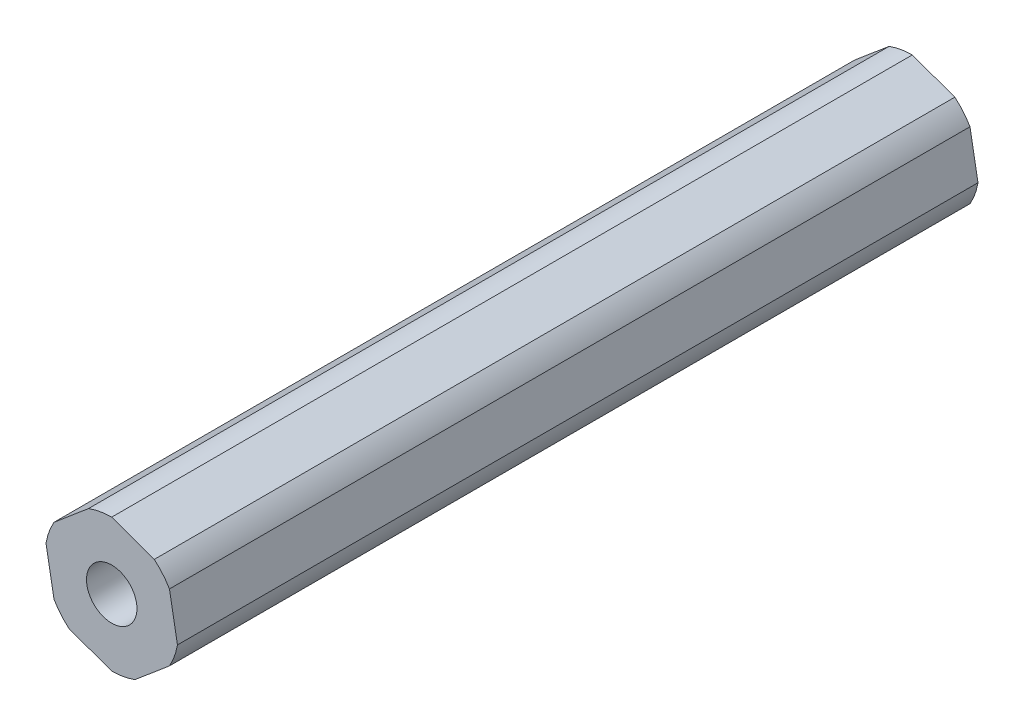
ISO-10303-21;
HEADER;
FILE_DESCRIPTION(('STEP AP214'),'2;1');
FILE_NAME('part.step','',(''),(''),'','','');
FILE_SCHEMA(('AUTOMOTIVE_DESIGN { 1 0 10303 214 1 1 1 1 }'));
ENDSEC;
DATA;
#1=APPLICATION_CONTEXT('core data for automotive mechanical design processes');
#2=APPLICATION_PROTOCOL_DEFINITION('international standard','automotive_design',2000,#1);
#3=PRODUCT_CONTEXT('',#1,'mechanical');
#4=PRODUCT('Part','Part','',(#3));
#5=PRODUCT_RELATED_PRODUCT_CATEGORY('part','',(#4));
#6=PRODUCT_DEFINITION_FORMATION('','',#4);
#7=PRODUCT_DEFINITION_CONTEXT('part definition',#1,'design');
#8=PRODUCT_DEFINITION('design','',#6,#7);
#9=PRODUCT_DEFINITION_SHAPE('','',#8);
#10=(LENGTH_UNIT() NAMED_UNIT(*) SI_UNIT(.MILLI.,.METRE.));
#11=(NAMED_UNIT(*) PLANE_ANGLE_UNIT() SI_UNIT($,.RADIAN.));
#12=(NAMED_UNIT(*) SI_UNIT($,.STERADIAN.) SOLID_ANGLE_UNIT());
#13=UNCERTAINTY_MEASURE_WITH_UNIT(LENGTH_MEASURE(1.E-05),#10,'distance_accuracy_value','');
#14=(GEOMETRIC_REPRESENTATION_CONTEXT(3) GLOBAL_UNCERTAINTY_ASSIGNED_CONTEXT((#13)) GLOBAL_UNIT_ASSIGNED_CONTEXT((#10,
#11,#12)) REPRESENTATION_CONTEXT('',''));
#15=CARTESIAN_POINT('',(0.,0.,0.));
#16=DIRECTION('',(0.,0.,1.));
#17=DIRECTION('',(1.,0.,0.));
#18=AXIS2_PLACEMENT_3D('',#15,#16,#17);
#19=CARTESIAN_POINT('',(0.,0.,81.0641));
#20=DIRECTION('',(0.,0.,-1.));
#21=DIRECTION('',(-1.,0.,0.));
#22=AXIS2_PLACEMENT_3D('',#19,#20,#21);
#23=CYLINDRICAL_SURFACE('',#22,6.75);
#24=CARTESIAN_POINT('',(0.,0.,0.));
#25=DIRECTION('',(0.,0.,1.));
#26=DIRECTION('',(1.,0.,0.));
#27=AXIS2_PLACEMENT_3D('',#24,#25,#26);
#28=CIRCLE('',#27,6.75);
#29=CARTESIAN_POINT('',(0.,6.75,0.));
#30=VERTEX_POINT('',#29);
#31=CARTESIAN_POINT('',(-2.3476328648293,6.32859541541196,0.));
#32=VERTEX_POINT('',#31);
#33=EDGE_CURVE('E176',#30,#32,#28,.T.);
#34=ORIENTED_EDGE('',*,*,#33,.T.);
#35=DIRECTION('',(0.,0.,-1.));
#36=VECTOR('',#35,1.);
#37=CARTESIAN_POINT('',(-2.3476328648293,6.32859541541196,81.0641));
#38=LINE('',#37,#36);
#39=CARTESIAN_POINT('',(-2.3476328648293,6.32859541541196,81.0641));
#40=VERTEX_POINT('',#39);
#41=EDGE_CURVE('E11',#40,#32,#38,.T.);
#42=ORIENTED_EDGE('',*,*,#41,.F.);
#43=CARTESIAN_POINT('',(0.,0.,81.0641));
#44=DIRECTION('',(0.,0.,1.));
#45=DIRECTION('',(1.,0.,0.));
#46=AXIS2_PLACEMENT_3D('',#43,#44,#45);
#47=CIRCLE('',#46,6.75);
#48=CARTESIAN_POINT('',(0.,6.75,81.0641));
#49=VERTEX_POINT('',#48);
#50=EDGE_CURVE('E211',#49,#40,#47,.T.);
#51=ORIENTED_EDGE('',*,*,#50,.F.);
#52=DIRECTION('',(0.,0.,-1.));
#53=VECTOR('',#52,1.);
#54=CARTESIAN_POINT('',(0.,6.75,81.0641));
#55=LINE('',#54,#53);
#56=EDGE_CURVE('E172',#49,#30,#55,.T.);
#57=ORIENTED_EDGE('',*,*,#56,.T.);
#58=EDGE_LOOP('',(#34,#42,#51,#57));
#59=FACE_BOUND('',#58,.T.);
#60=ADVANCED_FACE('F49',(#59),#23,.T.);
#61=CARTESIAN_POINT('',(-2.3476328648293,6.32859541541196,81.0641));
#62=DIRECTION('',(0.645142074045218,-0.764062631134801,0.));
#63=DIRECTION('',(0.7640626311348,0.645142074045218,0.));
#64=AXIS2_PLACEMENT_3D('',#61,#62,#63);
#65=PLANE('',#64);
#66=DIRECTION('',(-0.764062631134801,-0.645142074045218,0.));
#67=VECTOR('',#66,1.);
#68=CARTESIAN_POINT('',(-2.3476328648293,6.32859541541196,0.));
#69=LINE('',#68,#67);
#70=CARTESIAN_POINT('',(-5.84567147554496,3.375,0.));
#71=VERTEX_POINT('',#70);
#72=EDGE_CURVE('E180',#32,#71,#69,.T.);
#73=ORIENTED_EDGE('',*,*,#72,.T.);
#74=DIRECTION('',(0.,0.,-1.));
#75=VECTOR('',#74,1.);
#76=CARTESIAN_POINT('',(-5.84567147554496,3.375,81.0641));
#77=LINE('',#76,#75);
#78=CARTESIAN_POINT('',(-5.84567147554496,3.375,81.0641));
#79=VERTEX_POINT('',#78);
#80=EDGE_CURVE('E59',#79,#71,#77,.T.);
#81=ORIENTED_EDGE('',*,*,#80,.F.);
#82=DIRECTION('',(-0.764062631134801,-0.645142074045218,0.));
#83=VECTOR('',#82,1.);
#84=CARTESIAN_POINT('',(-2.3476328648293,6.32859541541196,81.0641));
#85=LINE('',#84,#83);
#86=EDGE_CURVE('E123',#40,#79,#85,.T.);
#87=ORIENTED_EDGE('',*,*,#86,.F.);
#88=ORIENTED_EDGE('',*,*,#41,.T.);
#89=EDGE_LOOP('',(#73,#81,#87,#88));
#90=FACE_BOUND('',#89,.T.);
#91=ADVANCED_FACE('F311',(#90),#65,.F.);
#92=CARTESIAN_POINT('',(0.,0.,81.0641));
#93=DIRECTION('',(0.,0.,-1.));
#94=DIRECTION('',(-1.,0.,0.));
#95=AXIS2_PLACEMENT_3D('',#92,#93,#94);
#96=CYLINDRICAL_SURFACE('',#95,6.75);
#97=CARTESIAN_POINT('',(0.,0.,0.));
#98=DIRECTION('',(0.,0.,1.));
#99=DIRECTION('',(1.,0.,0.));
#100=AXIS2_PLACEMENT_3D('',#97,#98,#99);
#101=CIRCLE('',#100,6.75);
#102=CARTESIAN_POINT('',(-6.65454083243515,1.13118800800456,0.));
#103=VERTEX_POINT('',#102);
#104=EDGE_CURVE('E184',#71,#103,#101,.T.);
#105=ORIENTED_EDGE('',*,*,#104,.T.);
#106=DIRECTION('',(0.,0.,-1.));
#107=VECTOR('',#106,1.);
#108=CARTESIAN_POINT('',(-6.65454083243515,1.13118800800456,81.0641));
#109=LINE('',#108,#107);
#110=CARTESIAN_POINT('',(-6.65454083243515,1.13118800800456,81.0641));
#111=VERTEX_POINT('',#110);
#112=EDGE_CURVE('E238',#111,#103,#109,.T.);
#113=ORIENTED_EDGE('',*,*,#112,.F.);
#114=CARTESIAN_POINT('',(0.,0.,81.0641));
#115=DIRECTION('',(0.,0.,1.));
#116=DIRECTION('',(1.,0.,0.));
#117=AXIS2_PLACEMENT_3D('',#114,#115,#116);
#118=CIRCLE('',#117,6.75);
#119=EDGE_CURVE('E264',#79,#111,#118,.T.);
#120=ORIENTED_EDGE('',*,*,#119,.F.);
#121=ORIENTED_EDGE('',*,*,#80,.T.);
#122=EDGE_LOOP('',(#105,#113,#120,#121));
#123=FACE_BOUND('',#122,.T.);
#124=ADVANCED_FACE('F315',(#123),#96,.T.);
#125=CARTESIAN_POINT('',(-6.65454083243515,1.13118800800456,81.0641));
#126=DIRECTION('',(0.984268685667726,0.17667810960594,0.));
#127=DIRECTION('',(-0.17667810960594,0.984268685667726,0.));
#128=AXIS2_PLACEMENT_3D('',#125,#126,#127);
#129=PLANE('',#128);
#130=DIRECTION('',(0.17667810960594,-0.984268685667725,0.));
#131=VECTOR('',#130,1.);
#132=CARTESIAN_POINT('',(-6.65454083243515,1.13118800800456,0.));
#133=LINE('',#132,#131);
#134=CARTESIAN_POINT('',(-5.84567147554496,-3.375,0.));
#135=VERTEX_POINT('',#134);
#136=EDGE_CURVE('E187',#103,#135,#133,.T.);
#137=ORIENTED_EDGE('',*,*,#136,.T.);
#138=DIRECTION('',(0.,0.,-1.));
#139=VECTOR('',#138,1.);
#140=CARTESIAN_POINT('',(-5.84567147554496,-3.375,81.0641));
#141=LINE('',#140,#139);
#142=CARTESIAN_POINT('',(-5.84567147554496,-3.375,81.0641));
#143=VERTEX_POINT('',#142);
#144=EDGE_CURVE('E234',#143,#135,#141,.T.);
#145=ORIENTED_EDGE('',*,*,#144,.F.);
#146=DIRECTION('',(0.17667810960594,-0.984268685667725,0.));
#147=VECTOR('',#146,1.);
#148=CARTESIAN_POINT('',(-6.65454083243515,1.13118800800456,81.0641));
#149=LINE('',#148,#147);
#150=EDGE_CURVE('E267',#111,#143,#149,.T.);
#151=ORIENTED_EDGE('',*,*,#150,.F.);
#152=ORIENTED_EDGE('',*,*,#112,.T.);
#153=EDGE_LOOP('',(#137,#145,#151,#152));
#154=FACE_BOUND('',#153,.T.);
#155=ADVANCED_FACE('F319',(#154),#129,.F.);
#156=CARTESIAN_POINT('',(0.,0.,81.0641));
#157=DIRECTION('',(0.,0.,-1.));
#158=DIRECTION('',(-1.,0.,0.));
#159=AXIS2_PLACEMENT_3D('',#156,#157,#158);
#160=CYLINDRICAL_SURFACE('',#159,6.75);
#161=CARTESIAN_POINT('',(0.,0.,0.));
#162=DIRECTION('',(0.,0.,1.));
#163=DIRECTION('',(1.,0.,0.));
#164=AXIS2_PLACEMENT_3D('',#161,#162,#163);
#165=CIRCLE('',#164,6.75);
#166=CARTESIAN_POINT('',(-4.30690796760584,-5.1974074074074,0.));
#167=VERTEX_POINT('',#166);
#168=EDGE_CURVE('E190',#135,#167,#165,.T.);
#169=ORIENTED_EDGE('',*,*,#168,.T.);
#170=DIRECTION('',(0.,0.,-1.));
#171=VECTOR('',#170,1.);
#172=CARTESIAN_POINT('',(-4.30690796760584,-5.1974074074074,81.0641));
#173=LINE('',#172,#171);
#174=CARTESIAN_POINT('',(-4.30690796760584,-5.1974074074074,81.0641));
#175=VERTEX_POINT('',#174);
#176=EDGE_CURVE('E230',#175,#167,#173,.T.);
#177=ORIENTED_EDGE('',*,*,#176,.F.);
#178=CARTESIAN_POINT('',(0.,0.,81.0641));
#179=DIRECTION('',(0.,0.,1.));
#180=DIRECTION('',(1.,0.,0.));
#181=AXIS2_PLACEMENT_3D('',#178,#179,#180);
#182=CIRCLE('',#181,6.75);
#183=EDGE_CURVE('E270',#143,#175,#182,.T.);
#184=ORIENTED_EDGE('',*,*,#183,.F.);
#185=ORIENTED_EDGE('',*,*,#144,.T.);
#186=EDGE_LOOP('',(#169,#177,#184,#185));
#187=FACE_BOUND('',#186,.T.);
#188=ADVANCED_FACE('F325',(#187),#160,.T.);
#189=CARTESIAN_POINT('',(-4.30690796760584,-5.1974074074074,81.0641));
#190=DIRECTION('',(0.339126611622508,0.94074074074074,0.));
#191=DIRECTION('',(-0.94074074074074,0.339126611622508,0.));
#192=AXIS2_PLACEMENT_3D('',#189,#190,#191);
#193=PLANE('',#192);
#194=DIRECTION('',(0.94074074074074,-0.339126611622508,0.));
#195=VECTOR('',#194,1.);
#196=CARTESIAN_POINT('',(-4.30690796760584,-5.1974074074074,0.));
#197=LINE('',#196,#195);
#198=CARTESIAN_POINT('',(0.,-6.75,0.));
#199=VERTEX_POINT('',#198);
#200=EDGE_CURVE('E193',#167,#199,#197,.T.);
#201=ORIENTED_EDGE('',*,*,#200,.T.);
#202=DIRECTION('',(0.,0.,-1.));
#203=VECTOR('',#202,1.);
#204=CARTESIAN_POINT('',(0.,-6.75,81.0641));
#205=LINE('',#204,#203);
#206=CARTESIAN_POINT('',(0.,-6.75,81.0641));
#207=VERTEX_POINT('',#206);
#208=EDGE_CURVE('E226',#207,#199,#205,.T.);
#209=ORIENTED_EDGE('',*,*,#208,.F.);
#210=DIRECTION('',(0.94074074074074,-0.339126611622508,0.));
#211=VECTOR('',#210,1.);
#212=CARTESIAN_POINT('',(-4.30690796760584,-5.1974074074074,81.0641));
#213=LINE('',#212,#211);
#214=EDGE_CURVE('E273',#175,#207,#213,.T.);
#215=ORIENTED_EDGE('',*,*,#214,.F.);
#216=ORIENTED_EDGE('',*,*,#176,.T.);
#217=EDGE_LOOP('',(#201,#209,#215,#216));
#218=FACE_BOUND('',#217,.T.);
#219=ADVANCED_FACE('F329',(#218),#193,.F.);
#220=CARTESIAN_POINT('',(0.,0.,81.0641));
#221=DIRECTION('',(0.,0.,-1.));
#222=DIRECTION('',(-1.,0.,0.));
#223=AXIS2_PLACEMENT_3D('',#220,#221,#222);
#224=CYLINDRICAL_SURFACE('',#223,6.75);
#225=CARTESIAN_POINT('',(0.,0.,0.));
#226=DIRECTION('',(0.,0.,1.));
#227=DIRECTION('',(1.,0.,0.));
#228=AXIS2_PLACEMENT_3D('',#225,#226,#227);
#229=CIRCLE('',#228,6.75);
#230=CARTESIAN_POINT('',(2.3476328648293,-6.32859541541197,0.));
#231=VERTEX_POINT('',#230);
#232=EDGE_CURVE('E196',#199,#231,#229,.T.);
#233=ORIENTED_EDGE('',*,*,#232,.T.);
#234=DIRECTION('',(0.,0.,-1.));
#235=VECTOR('',#234,1.);
#236=CARTESIAN_POINT('',(2.3476328648293,-6.32859541541197,81.0641));
#237=LINE('',#236,#235);
#238=CARTESIAN_POINT('',(2.3476328648293,-6.32859541541197,81.0641));
#239=VERTEX_POINT('',#238);
#240=EDGE_CURVE('E222',#239,#231,#237,.T.);
#241=ORIENTED_EDGE('',*,*,#240,.F.);
#242=CARTESIAN_POINT('',(0.,0.,81.0641));
#243=DIRECTION('',(0.,0.,1.));
#244=DIRECTION('',(1.,0.,0.));
#245=AXIS2_PLACEMENT_3D('',#242,#243,#244);
#246=CIRCLE('',#245,6.75);
#247=EDGE_CURVE('E276',#207,#239,#246,.T.);
#248=ORIENTED_EDGE('',*,*,#247,.F.);
#249=ORIENTED_EDGE('',*,*,#208,.T.);
#250=EDGE_LOOP('',(#233,#241,#248,#249));
#251=FACE_BOUND('',#250,.T.);
#252=ADVANCED_FACE('F333',(#251),#224,.T.);
#253=CARTESIAN_POINT('',(2.34763286482931,-6.32859541541197,81.0641));
#254=DIRECTION('',(-0.645142074045219,0.7640626311348,0.));
#255=DIRECTION('',(-0.7640626311348,-0.645142074045219,0.));
#256=AXIS2_PLACEMENT_3D('',#253,#254,#255);
#257=PLANE('',#256);
#258=DIRECTION('',(0.7640626311348,0.645142074045219,0.));
#259=VECTOR('',#258,1.);
#260=CARTESIAN_POINT('',(2.34763286482931,-6.32859541541197,0.));
#261=LINE('',#260,#259);
#262=CARTESIAN_POINT('',(5.84567147554496,-3.375,0.));
#263=VERTEX_POINT('',#262);
#264=EDGE_CURVE('E199',#231,#263,#261,.T.);
#265=ORIENTED_EDGE('',*,*,#264,.T.);
#266=DIRECTION('',(0.,0.,-1.));
#267=VECTOR('',#266,1.);
#268=CARTESIAN_POINT('',(5.84567147554496,-3.375,81.0641));
#269=LINE('',#268,#267);
#270=CARTESIAN_POINT('',(5.84567147554496,-3.375,81.0641));
#271=VERTEX_POINT('',#270);
#272=EDGE_CURVE('E218',#271,#263,#269,.T.);
#273=ORIENTED_EDGE('',*,*,#272,.F.);
#274=DIRECTION('',(0.7640626311348,0.645142074045219,0.));
#275=VECTOR('',#274,1.);
#276=CARTESIAN_POINT('',(2.34763286482931,-6.32859541541197,81.0641));
#277=LINE('',#276,#275);
#278=EDGE_CURVE('E279',#239,#271,#277,.T.);
#279=ORIENTED_EDGE('',*,*,#278,.F.);
#280=ORIENTED_EDGE('',*,*,#240,.T.);
#281=EDGE_LOOP('',(#265,#273,#279,#280));
#282=FACE_BOUND('',#281,.T.);
#283=ADVANCED_FACE('F287',(#282),#257,.F.);
#284=CARTESIAN_POINT('',(0.,0.,81.0641));
#285=DIRECTION('',(0.,0.,-1.));
#286=DIRECTION('',(-1.,0.,0.));
#287=AXIS2_PLACEMENT_3D('',#284,#285,#286);
#288=CYLINDRICAL_SURFACE('',#287,6.75);
#289=CARTESIAN_POINT('',(0.,0.,0.));
#290=DIRECTION('',(0.,0.,1.));
#291=DIRECTION('',(1.,0.,0.));
#292=AXIS2_PLACEMENT_3D('',#289,#290,#291);
#293=CIRCLE('',#292,6.75);
#294=CARTESIAN_POINT('',(6.65454083243515,-1.13118800800457,0.));
#295=VERTEX_POINT('',#294);
#296=EDGE_CURVE('E202',#263,#295,#293,.T.);
#297=ORIENTED_EDGE('',*,*,#296,.T.);
#298=DIRECTION('',(0.,0.,-1.));
#299=VECTOR('',#298,1.);
#300=CARTESIAN_POINT('',(6.65454083243515,-1.13118800800457,81.0641));
#301=LINE('',#300,#299);
#302=CARTESIAN_POINT('',(6.65454083243515,-1.13118800800457,81.0641));
#303=VERTEX_POINT('',#302);
#304=EDGE_CURVE('E165',#303,#295,#301,.T.);
#305=ORIENTED_EDGE('',*,*,#304,.F.);
#306=CARTESIAN_POINT('',(0.,0.,81.0641));
#307=DIRECTION('',(0.,0.,1.));
#308=DIRECTION('',(1.,0.,0.));
#309=AXIS2_PLACEMENT_3D('',#306,#307,#308);
#310=CIRCLE('',#309,6.75);
#311=EDGE_CURVE('E154',#271,#303,#310,.T.);
#312=ORIENTED_EDGE('',*,*,#311,.F.);
#313=ORIENTED_EDGE('',*,*,#272,.T.);
#314=EDGE_LOOP('',(#297,#305,#312,#313));
#315=FACE_BOUND('',#314,.T.);
#316=ADVANCED_FACE('F291',(#315),#288,.T.);
#317=CARTESIAN_POINT('',(6.65454083243515,-1.13118800800457,81.0641));
#318=DIRECTION('',(-0.984268685667725,-0.17667810960594,0.));
#319=DIRECTION('',(0.17667810960594,-0.984268685667725,0.));
#320=AXIS2_PLACEMENT_3D('',#317,#318,#319);
#321=PLANE('',#320);
#322=DIRECTION('',(-0.17667810960594,0.984268685667725,0.));
#323=VECTOR('',#322,1.);
#324=CARTESIAN_POINT('',(6.65454083243515,-1.13118800800457,0.));
#325=LINE('',#324,#323);
#326=CARTESIAN_POINT('',(5.84567147554496,3.375,0.));
#327=VERTEX_POINT('',#326);
#328=EDGE_CURVE('E163',#295,#327,#325,.T.);
#329=ORIENTED_EDGE('',*,*,#328,.T.);
#330=DIRECTION('',(0.,0.,-1.));
#331=VECTOR('',#330,1.);
#332=CARTESIAN_POINT('',(5.84567147554496,3.375,81.0641));
#333=LINE('',#332,#331);
#334=CARTESIAN_POINT('',(5.84567147554496,3.375,81.0641));
#335=VERTEX_POINT('',#334);
#336=EDGE_CURVE('E160',#335,#327,#333,.T.);
#337=ORIENTED_EDGE('',*,*,#336,.F.);
#338=DIRECTION('',(-0.17667810960594,0.984268685667725,0.));
#339=VECTOR('',#338,1.);
#340=CARTESIAN_POINT('',(6.65454083243515,-1.13118800800457,81.0641));
#341=LINE('',#340,#339);
#342=EDGE_CURVE('E148',#303,#335,#341,.T.);
#343=ORIENTED_EDGE('',*,*,#342,.F.);
#344=ORIENTED_EDGE('',*,*,#304,.T.);
#345=EDGE_LOOP('',(#329,#337,#343,#344));
#346=FACE_BOUND('',#345,.T.);
#347=ADVANCED_FACE('F161',(#346),#321,.F.);
#348=CARTESIAN_POINT('',(0.,0.,81.0641));
#349=DIRECTION('',(0.,0.,-1.));
#350=DIRECTION('',(-1.,0.,0.));
#351=AXIS2_PLACEMENT_3D('',#348,#349,#350);
#352=CYLINDRICAL_SURFACE('',#351,6.75);
#353=CARTESIAN_POINT('',(0.,0.,0.));
#354=DIRECTION('',(0.,0.,1.));
#355=DIRECTION('',(1.,0.,0.));
#356=AXIS2_PLACEMENT_3D('',#353,#354,#355);
#357=CIRCLE('',#356,6.75);
#358=CARTESIAN_POINT('',(4.30690796760584,5.1974074074074,0.));
#359=VERTEX_POINT('',#358);
#360=EDGE_CURVE('E109',#327,#359,#357,.T.);
#361=ORIENTED_EDGE('',*,*,#360,.T.);
#362=DIRECTION('',(0.,0.,-1.));
#363=VECTOR('',#362,1.);
#364=CARTESIAN_POINT('',(4.30690796760584,5.1974074074074,81.0641));
#365=LINE('',#364,#363);
#366=CARTESIAN_POINT('',(4.30690796760584,5.1974074074074,81.0641));
#367=VERTEX_POINT('',#366);
#368=EDGE_CURVE('E166',#367,#359,#365,.T.);
#369=ORIENTED_EDGE('',*,*,#368,.F.);
#370=CARTESIAN_POINT('',(0.,0.,81.0641));
#371=DIRECTION('',(0.,0.,1.));
#372=DIRECTION('',(1.,0.,0.));
#373=AXIS2_PLACEMENT_3D('',#370,#371,#372);
#374=CIRCLE('',#373,6.75);
#375=EDGE_CURVE('E152',#335,#367,#374,.T.);
#376=ORIENTED_EDGE('',*,*,#375,.F.);
#377=ORIENTED_EDGE('',*,*,#336,.T.);
#378=EDGE_LOOP('',(#361,#369,#376,#377));
#379=FACE_BOUND('',#378,.T.);
#380=ADVANCED_FACE('F168',(#379),#352,.T.);
#381=CARTESIAN_POINT('',(4.30690796760584,5.1974074074074,81.0641));
#382=DIRECTION('',(-0.339126611622507,-0.940740740740741,0.));
#383=DIRECTION('',(0.940740740740741,-0.339126611622507,0.));
#384=AXIS2_PLACEMENT_3D('',#381,#382,#383);
#385=PLANE('',#384);
#386=DIRECTION('',(-0.940740740740741,0.339126611622507,0.));
#387=VECTOR('',#386,1.);
#388=CARTESIAN_POINT('',(4.30690796760584,5.1974074074074,0.));
#389=LINE('',#388,#387);
#390=EDGE_CURVE('E115',#359,#30,#389,.T.);
#391=ORIENTED_EDGE('',*,*,#390,.T.);
#392=ORIENTED_EDGE('',*,*,#56,.F.);
#393=DIRECTION('',(-0.940740740740741,0.339126611622507,0.));
#394=VECTOR('',#393,1.);
#395=CARTESIAN_POINT('',(4.30690796760584,5.1974074074074,81.0641));
#396=LINE('',#395,#394);
#397=EDGE_CURVE('E68',#367,#49,#396,.T.);
#398=ORIENTED_EDGE('',*,*,#397,.F.);
#399=ORIENTED_EDGE('',*,*,#368,.T.);
#400=EDGE_LOOP('',(#391,#392,#398,#399));
#401=FACE_BOUND('',#400,.T.);
#402=ADVANCED_FACE('F299',(#401),#385,.F.);
#403=CARTESIAN_POINT('',(0.,0.,81.0641));
#404=DIRECTION('',(0.,0.,1.));
#405=DIRECTION('',(1.,0.,0.));
#406=AXIS2_PLACEMENT_3D('',#403,#404,#405);
#407=PLANE('',#406);
#408=CARTESIAN_POINT('',(0.,0.,81.0641));
#409=DIRECTION('',(0.,0.,1.));
#410=DIRECTION('',(1.,0.,0.));
#411=AXIS2_PLACEMENT_3D('',#408,#409,#410);
#412=CIRCLE('',#411,2.55269999999999);
#413=CARTESIAN_POINT('',(2.55269999999999,0.,81.0641));
#414=VERTEX_POINT('',#413);
#415=EDGE_CURVE('E251',#414,#414,#412,.T.);
#416=ORIENTED_EDGE('',*,*,#415,.F.);
#417=EDGE_LOOP('',(#416));
#418=FACE_BOUND('',#417,.T.);
#419=ORIENTED_EDGE('',*,*,#50,.T.);
#420=ORIENTED_EDGE('',*,*,#86,.T.);
#421=ORIENTED_EDGE('',*,*,#119,.T.);
#422=ORIENTED_EDGE('',*,*,#150,.T.);
#423=ORIENTED_EDGE('',*,*,#183,.T.);
#424=ORIENTED_EDGE('',*,*,#214,.T.);
#425=ORIENTED_EDGE('',*,*,#247,.T.);
#426=ORIENTED_EDGE('',*,*,#278,.T.);
#427=ORIENTED_EDGE('',*,*,#311,.T.);
#428=ORIENTED_EDGE('',*,*,#342,.T.);
#429=ORIENTED_EDGE('',*,*,#375,.T.);
#430=ORIENTED_EDGE('',*,*,#397,.T.);
#431=EDGE_LOOP('',(#419,#420,#421,#422,#423,#424,#425,#426,#427,#428,#429,#430));
#432=FACE_BOUND('',#431,.T.);
#433=ADVANCED_FACE('F150',(#418,#432),#407,.T.);
#434=CARTESIAN_POINT('',(0.,0.,0.));
#435=DIRECTION('',(0.,0.,1.));
#436=DIRECTION('',(1.,0.,0.));
#437=AXIS2_PLACEMENT_3D('',#434,#435,#436);
#438=PLANE('',#437);
#439=CARTESIAN_POINT('',(0.,0.,0.));
#440=DIRECTION('',(0.,0.,-1.));
#441=DIRECTION('',(-1.,0.,0.));
#442=AXIS2_PLACEMENT_3D('',#439,#440,#441);
#443=CIRCLE('',#442,2.55269999999999);
#444=CARTESIAN_POINT('',(-2.55269999999999,0.,0.));
#445=VERTEX_POINT('',#444);
#446=EDGE_CURVE('E538',#445,#445,#443,.T.);
#447=ORIENTED_EDGE('',*,*,#446,.F.);
#448=EDGE_LOOP('',(#447));
#449=FACE_BOUND('',#448,.T.);
#450=ORIENTED_EDGE('',*,*,#33,.F.);
#451=ORIENTED_EDGE('',*,*,#390,.F.);
#452=ORIENTED_EDGE('',*,*,#360,.F.);
#453=ORIENTED_EDGE('',*,*,#328,.F.);
#454=ORIENTED_EDGE('',*,*,#296,.F.);
#455=ORIENTED_EDGE('',*,*,#264,.F.);
#456=ORIENTED_EDGE('',*,*,#232,.F.);
#457=ORIENTED_EDGE('',*,*,#200,.F.);
#458=ORIENTED_EDGE('',*,*,#168,.F.);
#459=ORIENTED_EDGE('',*,*,#136,.F.);
#460=ORIENTED_EDGE('',*,*,#104,.F.);
#461=ORIENTED_EDGE('',*,*,#72,.F.);
#462=EDGE_LOOP('',(#450,#451,#452,#453,#454,#455,#456,#457,#458,#459,#460,#461));
#463=FACE_BOUND('',#462,.T.);
#464=ADVANCED_FACE('F294',(#449,#463),#438,.F.);
#465=CARTESIAN_POINT('',(0.,0.,0.));
#466=DIRECTION('',(0.,0.,1.));
#467=DIRECTION('',(1.,0.,0.));
#468=AXIS2_PLACEMENT_3D('',#465,#466,#467);
#469=CYLINDRICAL_SURFACE('',#468,2.0193);
#470=CARTESIAN_POINT('',(0.,0.,19.3704990541893));
#471=DIRECTION('',(0.,0.,-1.));
#472=DIRECTION('',(-1.,0.,0.));
#473=AXIS2_PLACEMENT_3D('',#470,#471,#472);
#474=CIRCLE('',#473,2.0193);
#475=CARTESIAN_POINT('',(-2.0193,0.,19.3704990541893));
#476=VERTEX_POINT('',#475);
#477=EDGE_CURVE('E52',#476,#476,#474,.T.);
#478=ORIENTED_EDGE('',*,*,#477,.T.);
#479=EDGE_LOOP('',(#478));
#480=FACE_BOUND('',#479,.T.);
#481=CARTESIAN_POINT('',(0.,0.,61.6936009458107));
#482=DIRECTION('',(0.,0.,1.));
#483=DIRECTION('',(1.,0.,0.));
#484=AXIS2_PLACEMENT_3D('',#481,#482,#483);
#485=CIRCLE('',#484,2.0193);
#486=CARTESIAN_POINT('',(2.0193,0.,61.6936009458107));
#487=VERTEX_POINT('',#486);
#488=EDGE_CURVE('E181',#487,#487,#485,.T.);
#489=ORIENTED_EDGE('',*,*,#488,.T.);
#490=EDGE_LOOP('',(#489));
#491=FACE_BOUND('',#490,.T.);
#492=ADVANCED_FACE('F379',(#480,#491),#469,.F.);
#493=CARTESIAN_POINT('',(0.,0.,62.0141));
#494=DIRECTION('',(0.,0.,1.));
#495=DIRECTION('',(1.,0.,0.));
#496=AXIS2_PLACEMENT_3D('',#493,#494,#495);
#497=CONICAL_SURFACE('',#496,2.55269999999999,1.02974425867665);
#498=CARTESIAN_POINT('',(0.,0.,62.0141));
#499=DIRECTION('',(0.,0.,1.));
#500=DIRECTION('',(1.,0.,0.));
#501=AXIS2_PLACEMENT_3D('',#498,#499,#500);
#502=CIRCLE('',#501,2.55269999999999);
#503=CARTESIAN_POINT('',(2.55269999999999,0.,62.0141));
#504=VERTEX_POINT('',#503);
#505=EDGE_CURVE('E246',#504,#504,#502,.T.);
#506=ORIENTED_EDGE('',*,*,#505,.T.);
#507=EDGE_LOOP('',(#506));
#508=FACE_BOUND('',#507,.T.);
#509=ORIENTED_EDGE('',*,*,#488,.F.);
#510=EDGE_LOOP('',(#509));
#511=FACE_BOUND('',#510,.T.);
#512=ADVANCED_FACE('F373',(#508,#511),#497,.F.);
#513=CARTESIAN_POINT('',(0.,0.,81.0641));
#514=DIRECTION('',(0.,0.,1.));
#515=DIRECTION('',(1.,0.,0.));
#516=AXIS2_PLACEMENT_3D('',#513,#514,#515);
#517=CYLINDRICAL_SURFACE('',#516,2.55269999999999);
#518=ORIENTED_EDGE('',*,*,#505,.F.);
#519=EDGE_LOOP('',(#518));
#520=FACE_BOUND('',#519,.T.);
#521=ORIENTED_EDGE('',*,*,#415,.T.);
#522=EDGE_LOOP('',(#521));
#523=FACE_BOUND('',#522,.T.);
#524=ADVANCED_FACE('F378',(#520,#523),#517,.F.);
#525=CARTESIAN_POINT('',(0.,0.,19.05));
#526=DIRECTION('',(0.,0.,-1.));
#527=DIRECTION('',(-1.,0.,0.));
#528=AXIS2_PLACEMENT_3D('',#525,#526,#527);
#529=CONICAL_SURFACE('',#528,2.55269999999999,1.02974425867665);
#530=CARTESIAN_POINT('',(0.,0.,19.05));
#531=DIRECTION('',(0.,0.,-1.));
#532=DIRECTION('',(-1.,0.,0.));
#533=AXIS2_PLACEMENT_3D('',#530,#531,#532);
#534=CIRCLE('',#533,2.55269999999999);
#535=CARTESIAN_POINT('',(-2.55269999999999,0.,19.05));
#536=VERTEX_POINT('',#535);
#537=EDGE_CURVE('E535',#536,#536,#534,.T.);
#538=ORIENTED_EDGE('',*,*,#537,.T.);
#539=EDGE_LOOP('',(#538));
#540=FACE_BOUND('',#539,.T.);
#541=ORIENTED_EDGE('',*,*,#477,.F.);
#542=EDGE_LOOP('',(#541));
#543=FACE_BOUND('',#542,.T.);
#544=ADVANCED_FACE('F392',(#540,#543),#529,.F.);
#545=CARTESIAN_POINT('',(0.,0.,0.));
#546=DIRECTION('',(0.,0.,-1.));
#547=DIRECTION('',(-1.,0.,0.));
#548=AXIS2_PLACEMENT_3D('',#545,#546,#547);
#549=CYLINDRICAL_SURFACE('',#548,2.55269999999999);
#550=ORIENTED_EDGE('',*,*,#537,.F.);
#551=EDGE_LOOP('',(#550));
#552=FACE_BOUND('',#551,.T.);
#553=ORIENTED_EDGE('',*,*,#446,.T.);
#554=EDGE_LOOP('',(#553));
#555=FACE_BOUND('',#554,.T.);
#556=ADVANCED_FACE('F424',(#552,#555),#549,.F.);
#557=CLOSED_SHELL('',(#60,#91,#124,#155,#188,#219,#252,#283,#316,#347,#380,#402,#433,#464,#492,
#512,#524,#544,#556));
#558=MANIFOLD_SOLID_BREP('B2',#557);
#559=ADVANCED_BREP_SHAPE_REPRESENTATION('',(#18,#558),#14);
#560=SHAPE_DEFINITION_REPRESENTATION(#9,#559);
ENDSEC;
END-ISO-10303-21;
